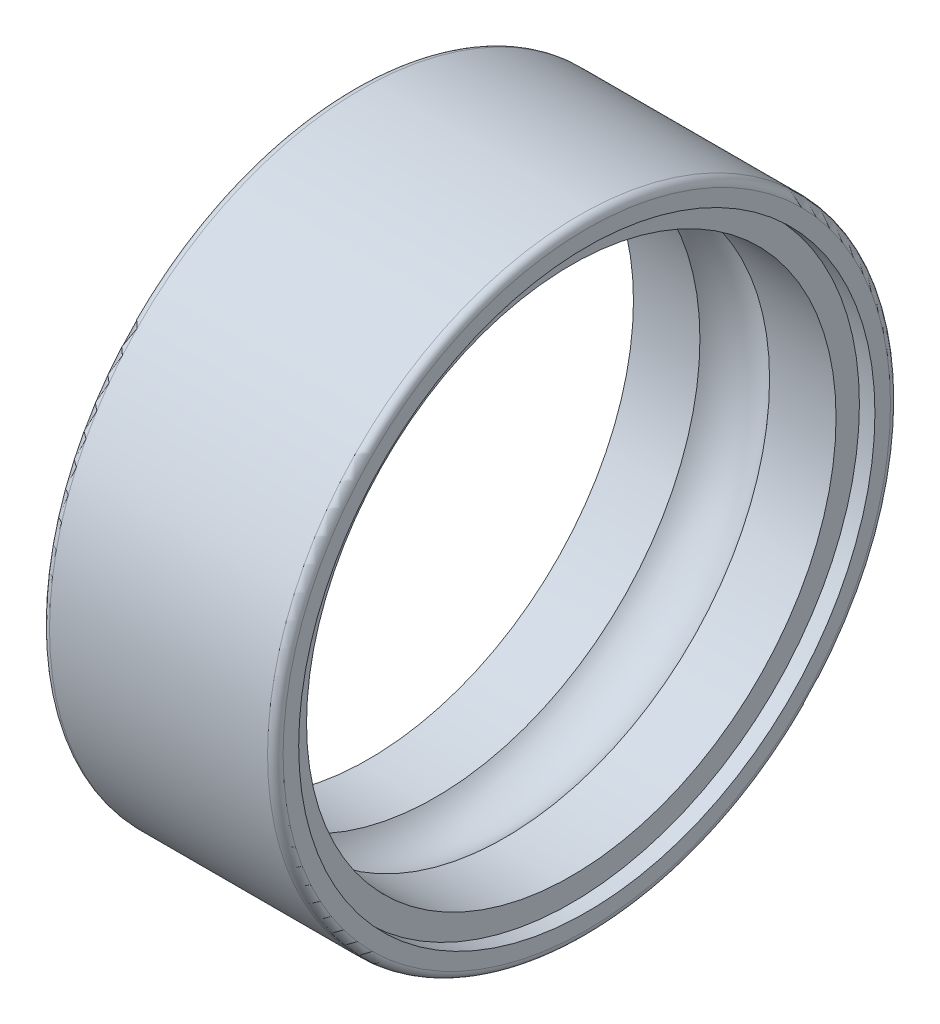
ISO-10303-21;
HEADER;
FILE_DESCRIPTION(('STEP AP214'),'2;1');
FILE_NAME('part.step','',(''),(''),'','','');
FILE_SCHEMA(('AUTOMOTIVE_DESIGN { 1 0 10303 214 1 1 1 1 }'));
ENDSEC;
DATA;
#1=APPLICATION_CONTEXT('core data for automotive mechanical design processes');
#2=APPLICATION_PROTOCOL_DEFINITION('international standard','automotive_design',2000,#1);
#3=PRODUCT_CONTEXT('',#1,'mechanical');
#4=PRODUCT('Part','Part','',(#3));
#5=PRODUCT_RELATED_PRODUCT_CATEGORY('part','',(#4));
#6=PRODUCT_DEFINITION_FORMATION('','',#4);
#7=PRODUCT_DEFINITION_CONTEXT('part definition',#1,'design');
#8=PRODUCT_DEFINITION('design','',#6,#7);
#9=PRODUCT_DEFINITION_SHAPE('','',#8);
#10=(LENGTH_UNIT() NAMED_UNIT(*) SI_UNIT(.MILLI.,.METRE.));
#11=(NAMED_UNIT(*) PLANE_ANGLE_UNIT() SI_UNIT($,.RADIAN.));
#12=(NAMED_UNIT(*) SI_UNIT($,.STERADIAN.) SOLID_ANGLE_UNIT());
#13=UNCERTAINTY_MEASURE_WITH_UNIT(LENGTH_MEASURE(1.E-05),#10,'distance_accuracy_value','');
#14=(GEOMETRIC_REPRESENTATION_CONTEXT(3) GLOBAL_UNCERTAINTY_ASSIGNED_CONTEXT((#13)) GLOBAL_UNIT_ASSIGNED_CONTEXT((#10,
#11,#12)) REPRESENTATION_CONTEXT('',''));
#15=CARTESIAN_POINT('',(0.,0.,0.));
#16=DIRECTION('',(0.,0.,1.));
#17=DIRECTION('',(1.,0.,0.));
#18=AXIS2_PLACEMENT_3D('',#15,#16,#17);
#19=CARTESIAN_POINT('',(1.5,0.,0.));
#20=DIRECTION('',(1.,0.,0.));
#21=DIRECTION('',(0.,0.,-1.));
#22=AXIS2_PLACEMENT_3D('',#19,#20,#21);
#23=TOROIDAL_SURFACE('',#22,3.,0.599999999999999);
#24=CARTESIAN_POINT('',(1.94721359549996,0.,0.));
#25=DIRECTION('',(-1.,0.,0.));
#26=DIRECTION('',(0.,0.,1.));
#27=AXIS2_PLACEMENT_3D('',#24,#25,#26);
#28=CIRCLE('',#27,3.4);
#29=CARTESIAN_POINT('',(1.94721359549996,0.,3.4));
#30=VERTEX_POINT('',#29);
#31=EDGE_CURVE('E140',#30,#30,#28,.F.);
#32=ORIENTED_EDGE('',*,*,#31,.T.);
#33=EDGE_LOOP('',(#32));
#34=FACE_BOUND('',#33,.T.);
#35=CARTESIAN_POINT('',(1.05278640450004,0.,0.));
#36=DIRECTION('',(-1.,0.,0.));
#37=DIRECTION('',(0.,0.,1.));
#38=AXIS2_PLACEMENT_3D('',#35,#36,#37);
#39=CIRCLE('',#38,3.4);
#40=CARTESIAN_POINT('',(1.05278640450004,0.,3.4));
#41=VERTEX_POINT('',#40);
#42=EDGE_CURVE('E143',#41,#41,#39,.T.);
#43=ORIENTED_EDGE('',*,*,#42,.T.);
#44=EDGE_LOOP('',(#43));
#45=FACE_BOUND('',#44,.T.);
#46=ADVANCED_FACE('F15',(#34,#45),#23,.F.);
#47=CARTESIAN_POINT('',(3.,0.,0.));
#48=DIRECTION('',(-1.,0.,0.));
#49=DIRECTION('',(0.,0.,1.));
#50=AXIS2_PLACEMENT_3D('',#47,#48,#49);
#51=CYLINDRICAL_SURFACE('',#50,3.4);
#52=CARTESIAN_POINT('',(0.1992,0.,0.));
#53=DIRECTION('',(-1.,0.,0.));
#54=DIRECTION('',(0.,0.,1.));
#55=AXIS2_PLACEMENT_3D('',#52,#53,#54);
#56=CIRCLE('',#55,3.4);
#57=CARTESIAN_POINT('',(0.1992,0.,3.4));
#58=VERTEX_POINT('',#57);
#59=EDGE_CURVE('E19',#58,#58,#56,.F.);
#60=ORIENTED_EDGE('',*,*,#59,.F.);
#61=EDGE_LOOP('',(#60));
#62=FACE_BOUND('',#61,.T.);
#63=ORIENTED_EDGE('',*,*,#42,.F.);
#64=EDGE_LOOP('',(#63));
#65=FACE_BOUND('',#64,.T.);
#66=ADVANCED_FACE('F101',(#62,#65),#51,.F.);
#67=CARTESIAN_POINT('',(3.,0.,0.));
#68=DIRECTION('',(-1.,0.,0.));
#69=DIRECTION('',(0.,0.,1.));
#70=AXIS2_PLACEMENT_3D('',#67,#68,#69);
#71=CYLINDRICAL_SURFACE('',#70,3.4);
#72=ORIENTED_EDGE('',*,*,#31,.F.);
#73=EDGE_LOOP('',(#72));
#74=FACE_BOUND('',#73,.T.);
#75=CARTESIAN_POINT('',(2.8008,0.,0.));
#76=DIRECTION('',(-1.,0.,0.));
#77=DIRECTION('',(0.,0.,1.));
#78=AXIS2_PLACEMENT_3D('',#75,#76,#77);
#79=CIRCLE('',#78,3.4);
#80=CARTESIAN_POINT('',(2.8008,0.,3.4));
#81=VERTEX_POINT('',#80);
#82=EDGE_CURVE('E136',#81,#81,#79,.T.);
#83=ORIENTED_EDGE('',*,*,#82,.F.);
#84=EDGE_LOOP('',(#83));
#85=FACE_BOUND('',#84,.T.);
#86=ADVANCED_FACE('F98',(#74,#85),#71,.F.);
#87=CARTESIAN_POINT('',(0.1992,3.7,0.));
#88=DIRECTION('',(-1.,0.,0.));
#89=DIRECTION('',(0.,0.,1.));
#90=AXIS2_PLACEMENT_3D('',#87,#88,#89);
#91=PLANE('',#90);
#92=CARTESIAN_POINT('',(0.1992,0.,0.));
#93=DIRECTION('',(-1.,0.,0.));
#94=DIRECTION('',(0.,0.,1.));
#95=AXIS2_PLACEMENT_3D('',#92,#93,#94);
#96=CIRCLE('',#95,3.7);
#97=CARTESIAN_POINT('',(0.1992,0.,3.7));
#98=VERTEX_POINT('',#97);
#99=EDGE_CURVE('E134',#98,#98,#96,.T.);
#100=ORIENTED_EDGE('',*,*,#99,.T.);
#101=EDGE_LOOP('',(#100));
#102=FACE_BOUND('',#101,.T.);
#103=ORIENTED_EDGE('',*,*,#59,.T.);
#104=EDGE_LOOP('',(#103));
#105=FACE_BOUND('',#104,.T.);
#106=ADVANCED_FACE('F94',(#102,#105),#91,.T.);
#107=CARTESIAN_POINT('',(2.8008,3.4,0.));
#108=DIRECTION('',(1.,0.,0.));
#109=DIRECTION('',(0.,0.,-1.));
#110=AXIS2_PLACEMENT_3D('',#107,#108,#109);
#111=PLANE('',#110);
#112=ORIENTED_EDGE('',*,*,#82,.T.);
#113=EDGE_LOOP('',(#112));
#114=FACE_BOUND('',#113,.T.);
#115=CARTESIAN_POINT('',(2.8008,0.,0.));
#116=DIRECTION('',(-1.,0.,0.));
#117=DIRECTION('',(0.,0.,1.));
#118=AXIS2_PLACEMENT_3D('',#115,#116,#117);
#119=CIRCLE('',#118,3.7);
#120=CARTESIAN_POINT('',(2.8008,0.,3.7));
#121=VERTEX_POINT('',#120);
#122=EDGE_CURVE('E127',#121,#121,#119,.F.);
#123=ORIENTED_EDGE('',*,*,#122,.T.);
#124=EDGE_LOOP('',(#123));
#125=FACE_BOUND('',#124,.T.);
#126=ADVANCED_FACE('F90',(#114,#125),#111,.T.);
#127=CARTESIAN_POINT('',(3.,0.,0.));
#128=DIRECTION('',(-1.,0.,0.));
#129=DIRECTION('',(0.,0.,1.));
#130=AXIS2_PLACEMENT_3D('',#127,#128,#129);
#131=CYLINDRICAL_SURFACE('',#130,3.7);
#132=CARTESIAN_POINT('',(0.,0.,0.));
#133=DIRECTION('',(-1.,0.,0.));
#134=DIRECTION('',(0.,0.,1.));
#135=AXIS2_PLACEMENT_3D('',#132,#133,#134);
#136=CIRCLE('',#135,3.7);
#137=CARTESIAN_POINT('',(0.,0.,3.7));
#138=VERTEX_POINT('',#137);
#139=EDGE_CURVE('E122',#138,#138,#136,.F.);
#140=ORIENTED_EDGE('',*,*,#139,.F.);
#141=EDGE_LOOP('',(#140));
#142=FACE_BOUND('',#141,.T.);
#143=ORIENTED_EDGE('',*,*,#99,.F.);
#144=EDGE_LOOP('',(#143));
#145=FACE_BOUND('',#144,.T.);
#146=ADVANCED_FACE('F86',(#142,#145),#131,.F.);
#147=CARTESIAN_POINT('',(3.,0.,0.));
#148=DIRECTION('',(-1.,0.,0.));
#149=DIRECTION('',(0.,0.,1.));
#150=AXIS2_PLACEMENT_3D('',#147,#148,#149);
#151=CYLINDRICAL_SURFACE('',#150,3.7);
#152=ORIENTED_EDGE('',*,*,#122,.F.);
#153=EDGE_LOOP('',(#152));
#154=FACE_BOUND('',#153,.T.);
#155=CARTESIAN_POINT('',(3.,0.,0.));
#156=DIRECTION('',(-1.,0.,0.));
#157=DIRECTION('',(0.,0.,1.));
#158=AXIS2_PLACEMENT_3D('',#155,#156,#157);
#159=CIRCLE('',#158,3.7);
#160=CARTESIAN_POINT('',(3.,0.,3.7));
#161=VERTEX_POINT('',#160);
#162=EDGE_CURVE('E120',#161,#161,#159,.T.);
#163=ORIENTED_EDGE('',*,*,#162,.F.);
#164=EDGE_LOOP('',(#163));
#165=FACE_BOUND('',#164,.T.);
#166=ADVANCED_FACE('F82',(#154,#165),#151,.F.);
#167=CARTESIAN_POINT('',(0.,3.9,0.));
#168=DIRECTION('',(-1.,0.,0.));
#169=DIRECTION('',(0.,0.,1.));
#170=AXIS2_PLACEMENT_3D('',#167,#168,#169);
#171=PLANE('',#170);
#172=CARTESIAN_POINT('',(0.,0.,0.));
#173=DIRECTION('',(1.,0.,0.));
#174=DIRECTION('',(0.,0.,-1.));
#175=AXIS2_PLACEMENT_3D('',#172,#173,#174);
#176=CIRCLE('',#175,3.9);
#177=CARTESIAN_POINT('',(0.,0.,-3.9));
#178=VERTEX_POINT('',#177);
#179=EDGE_CURVE('E66',#178,#178,#176,.T.);
#180=ORIENTED_EDGE('',*,*,#179,.F.);
#181=EDGE_LOOP('',(#180));
#182=FACE_BOUND('',#181,.T.);
#183=ORIENTED_EDGE('',*,*,#139,.T.);
#184=EDGE_LOOP('',(#183));
#185=FACE_BOUND('',#184,.T.);
#186=ADVANCED_FACE('F72',(#182,#185),#171,.T.);
#187=CARTESIAN_POINT('',(3.,3.7,0.));
#188=DIRECTION('',(1.,0.,0.));
#189=DIRECTION('',(0.,0.,-1.));
#190=AXIS2_PLACEMENT_3D('',#187,#188,#189);
#191=PLANE('',#190);
#192=ORIENTED_EDGE('',*,*,#162,.T.);
#193=EDGE_LOOP('',(#192));
#194=FACE_BOUND('',#193,.T.);
#195=CARTESIAN_POINT('',(3.,0.,0.));
#196=DIRECTION('',(-1.,0.,0.));
#197=DIRECTION('',(0.,0.,-1.));
#198=AXIS2_PLACEMENT_3D('',#195,#196,#197);
#199=CIRCLE('',#198,3.9);
#200=CARTESIAN_POINT('',(3.,0.,-3.9));
#201=VERTEX_POINT('',#200);
#202=EDGE_CURVE('E28',#201,#201,#199,.T.);
#203=ORIENTED_EDGE('',*,*,#202,.F.);
#204=EDGE_LOOP('',(#203));
#205=FACE_BOUND('',#204,.T.);
#206=ADVANCED_FACE('F81',(#194,#205),#191,.T.);
#207=CARTESIAN_POINT('',(0.1,0.,0.));
#208=DIRECTION('',(1.,0.,0.));
#209=DIRECTION('',(0.,0.,-1.));
#210=AXIS2_PLACEMENT_3D('',#207,#208,#209);
#211=TOROIDAL_SURFACE('',#210,3.9,0.1);
#212=CARTESIAN_POINT('',(0.0999999999999998,0.,0.));
#213=DIRECTION('',(-1.,0.,0.));
#214=DIRECTION('',(0.,0.,1.));
#215=AXIS2_PLACEMENT_3D('',#212,#213,#214);
#216=CIRCLE('',#215,4.);
#217=CARTESIAN_POINT('',(0.0999999999999998,0.,4.));
#218=VERTEX_POINT('',#217);
#219=EDGE_CURVE('E23',#218,#218,#216,.F.);
#220=ORIENTED_EDGE('',*,*,#219,.F.);
#221=EDGE_LOOP('',(#220));
#222=FACE_BOUND('',#221,.T.);
#223=ORIENTED_EDGE('',*,*,#179,.T.);
#224=EDGE_LOOP('',(#223));
#225=FACE_BOUND('',#224,.T.);
#226=ADVANCED_FACE('F46',(#222,#225),#211,.T.);
#227=CARTESIAN_POINT('',(2.9,0.,0.));
#228=DIRECTION('',(1.,0.,0.));
#229=DIRECTION('',(0.,0.,-1.));
#230=AXIS2_PLACEMENT_3D('',#227,#228,#229);
#231=TOROIDAL_SURFACE('',#230,3.9,0.1);
#232=ORIENTED_EDGE('',*,*,#202,.T.);
#233=EDGE_LOOP('',(#232));
#234=FACE_BOUND('',#233,.T.);
#235=CARTESIAN_POINT('',(2.9,0.,0.));
#236=DIRECTION('',(-1.,0.,0.));
#237=DIRECTION('',(0.,0.,1.));
#238=AXIS2_PLACEMENT_3D('',#235,#236,#237);
#239=CIRCLE('',#238,4.);
#240=CARTESIAN_POINT('',(2.9,0.,4.));
#241=VERTEX_POINT('',#240);
#242=EDGE_CURVE('E10',#241,#241,#239,.T.);
#243=ORIENTED_EDGE('',*,*,#242,.F.);
#244=EDGE_LOOP('',(#243));
#245=FACE_BOUND('',#244,.T.);
#246=ADVANCED_FACE('F40',(#234,#245),#231,.T.);
#247=CARTESIAN_POINT('',(3.,0.,0.));
#248=DIRECTION('',(-1.,0.,0.));
#249=DIRECTION('',(0.,0.,1.));
#250=AXIS2_PLACEMENT_3D('',#247,#248,#249);
#251=CYLINDRICAL_SURFACE('',#250,4.);
#252=ORIENTED_EDGE('',*,*,#242,.T.);
#253=EDGE_LOOP('',(#252));
#254=FACE_BOUND('',#253,.T.);
#255=ORIENTED_EDGE('',*,*,#219,.T.);
#256=EDGE_LOOP('',(#255));
#257=FACE_BOUND('',#256,.T.);
#258=ADVANCED_FACE('F45',(#254,#257),#251,.T.);
#259=CLOSED_SHELL('',(#46,#66,#86,#106,#126,#146,#166,#186,#206,#226,#246,#258));
#260=MANIFOLD_SOLID_BREP('B1',#259);
#261=ADVANCED_BREP_SHAPE_REPRESENTATION('',(#18,#260),#14);
#262=SHAPE_DEFINITION_REPRESENTATION(#9,#261);
ENDSEC;
END-ISO-10303-21;
